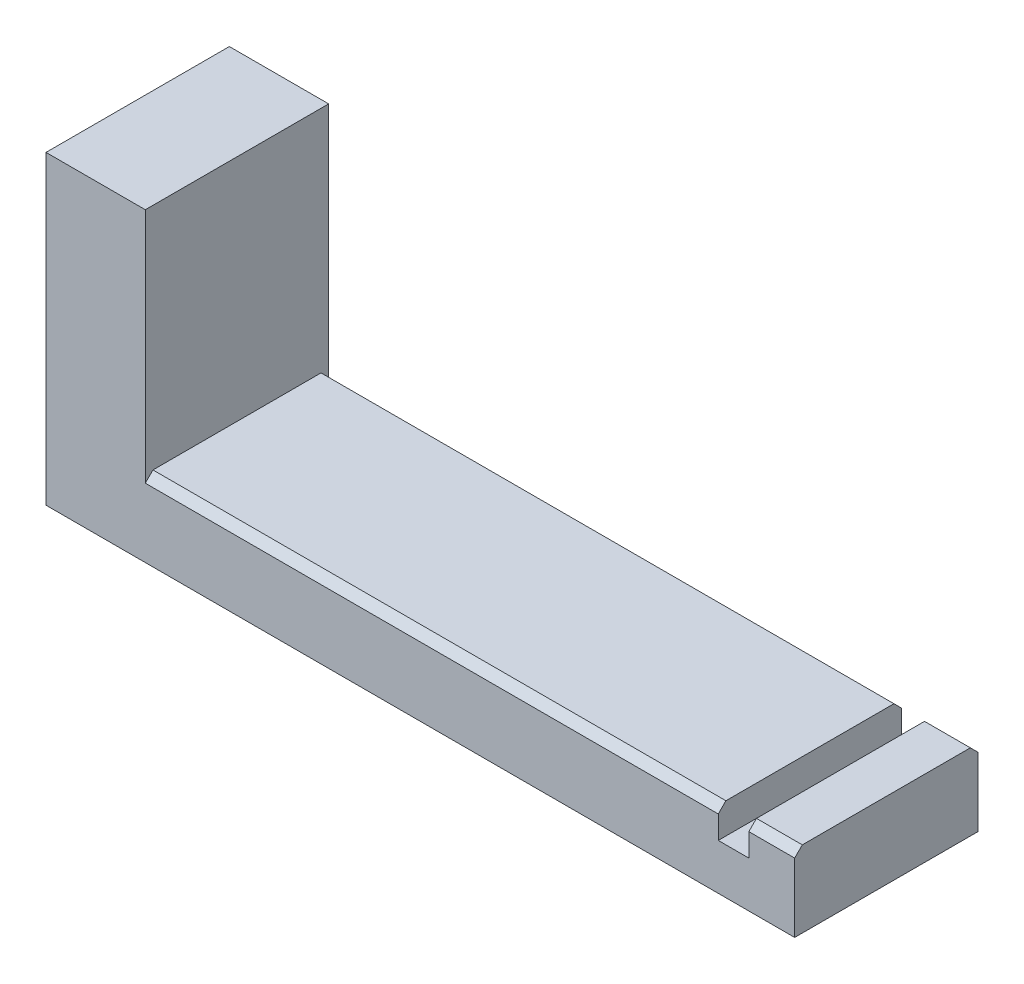
ISO-10303-21;
HEADER;
FILE_DESCRIPTION(('STEP AP214'),'2;1');
FILE_NAME('part.step','',(''),(''),'','','');
FILE_SCHEMA(('AUTOMOTIVE_DESIGN { 1 0 10303 214 1 1 1 1 }'));
ENDSEC;
DATA;
#1=APPLICATION_CONTEXT('core data for automotive mechanical design processes');
#2=APPLICATION_PROTOCOL_DEFINITION('international standard','automotive_design',2000,#1);
#3=PRODUCT_CONTEXT('',#1,'mechanical');
#4=PRODUCT('Part','Part','',(#3));
#5=PRODUCT_RELATED_PRODUCT_CATEGORY('part','',(#4));
#6=PRODUCT_DEFINITION_FORMATION('','',#4);
#7=PRODUCT_DEFINITION_CONTEXT('part definition',#1,'design');
#8=PRODUCT_DEFINITION('design','',#6,#7);
#9=PRODUCT_DEFINITION_SHAPE('','',#8);
#10=(LENGTH_UNIT() NAMED_UNIT(*) SI_UNIT(.MILLI.,.METRE.));
#11=(NAMED_UNIT(*) PLANE_ANGLE_UNIT() SI_UNIT($,.RADIAN.));
#12=(NAMED_UNIT(*) SI_UNIT($,.STERADIAN.) SOLID_ANGLE_UNIT());
#13=UNCERTAINTY_MEASURE_WITH_UNIT(LENGTH_MEASURE(1.E-05),#10,'distance_accuracy_value','');
#14=(GEOMETRIC_REPRESENTATION_CONTEXT(3) GLOBAL_UNCERTAINTY_ASSIGNED_CONTEXT((#13)) GLOBAL_UNIT_ASSIGNED_CONTEXT((#10,
#11,#12)) REPRESENTATION_CONTEXT('',''));
#15=CARTESIAN_POINT('',(0.,0.,0.));
#16=DIRECTION('',(0.,0.,1.));
#17=DIRECTION('',(1.,0.,0.));
#18=AXIS2_PLACEMENT_3D('',#15,#16,#17);
#19=CARTESIAN_POINT('',(98.,0.,12.));
#20=DIRECTION('',(0.,1.,0.));
#21=DIRECTION('',(-1.,0.,0.));
#22=AXIS2_PLACEMENT_3D('',#19,#20,#21);
#23=PLANE('',#22);
#24=DIRECTION('',(1.,0.,0.));
#25=VECTOR('',#24,1.);
#26=CARTESIAN_POINT('',(98.,0.,-12.));
#27=LINE('',#26,#25);
#28=CARTESIAN_POINT('',(0.,0.,-12.));
#29=VERTEX_POINT('',#28);
#30=CARTESIAN_POINT('',(98.,0.,-12.));
#31=VERTEX_POINT('',#30);
#32=EDGE_CURVE('E172',#29,#31,#27,.T.);
#33=ORIENTED_EDGE('',*,*,#32,.T.);
#34=DIRECTION('',(0.,0.,-1.));
#35=VECTOR('',#34,1.);
#36=CARTESIAN_POINT('',(98.,0.,12.));
#37=LINE('',#36,#35);
#38=CARTESIAN_POINT('',(98.,0.,12.));
#39=VERTEX_POINT('',#38);
#40=EDGE_CURVE('E151',#39,#31,#37,.T.);
#41=ORIENTED_EDGE('',*,*,#40,.F.);
#42=DIRECTION('',(1.,0.,0.));
#43=VECTOR('',#42,1.);
#44=CARTESIAN_POINT('',(98.,0.,12.));
#45=LINE('',#44,#43);
#46=CARTESIAN_POINT('',(0.,0.,12.));
#47=VERTEX_POINT('',#46);
#48=EDGE_CURVE('E160',#47,#39,#45,.T.);
#49=ORIENTED_EDGE('',*,*,#48,.F.);
#50=DIRECTION('',(0.,0.,-1.));
#51=VECTOR('',#50,1.);
#52=CARTESIAN_POINT('',(0.,0.,12.));
#53=LINE('',#52,#51);
#54=EDGE_CURVE('E243',#47,#29,#53,.T.);
#55=ORIENTED_EDGE('',*,*,#54,.T.);
#56=EDGE_LOOP('',(#33,#41,#49,#55));
#57=FACE_BOUND('',#56,.T.);
#58=ADVANCED_FACE('F43',(#57),#23,.F.);
#59=CARTESIAN_POINT('',(98.,10.,12.));
#60=DIRECTION('',(-1.,0.,0.));
#61=DIRECTION('',(0.,0.,1.));
#62=AXIS2_PLACEMENT_3D('',#59,#60,#61);
#63=PLANE('',#62);
#64=DIRECTION('',(0.,1.,0.));
#65=VECTOR('',#64,1.);
#66=CARTESIAN_POINT('',(98.,10.,-12.));
#67=LINE('',#66,#65);
#68=CARTESIAN_POINT('',(98.,9.,-12.));
#69=VERTEX_POINT('',#68);
#70=EDGE_CURVE('E280',#31,#69,#67,.T.);
#71=ORIENTED_EDGE('',*,*,#70,.T.);
#72=DIRECTION('',(0.,0.707106781186548,0.707106781186547));
#73=VECTOR('',#72,1.);
#74=CARTESIAN_POINT('',(98.,10.,-11.));
#75=LINE('',#74,#73);
#76=CARTESIAN_POINT('',(98.,10.,-11.));
#77=VERTEX_POINT('',#76);
#78=EDGE_CURVE('E194',#69,#77,#75,.T.);
#79=ORIENTED_EDGE('',*,*,#78,.T.);
#80=DIRECTION('',(0.,0.,-1.));
#81=VECTOR('',#80,1.);
#82=CARTESIAN_POINT('',(98.,10.,12.));
#83=LINE('',#82,#81);
#84=CARTESIAN_POINT('',(98.,10.,11.));
#85=VERTEX_POINT('',#84);
#86=EDGE_CURVE('E174',#85,#77,#83,.T.);
#87=ORIENTED_EDGE('',*,*,#86,.F.);
#88=DIRECTION('',(0.,0.707106781186548,-0.707106781186547));
#89=VECTOR('',#88,1.);
#90=CARTESIAN_POINT('',(98.,9.,12.));
#91=LINE('',#90,#89);
#92=CARTESIAN_POINT('',(98.,8.99999999999999,12.));
#93=VERTEX_POINT('',#92);
#94=EDGE_CURVE('E155',#85,#93,#91,.F.);
#95=ORIENTED_EDGE('',*,*,#94,.T.);
#96=DIRECTION('',(0.,1.,0.));
#97=VECTOR('',#96,1.);
#98=CARTESIAN_POINT('',(98.,10.,12.));
#99=LINE('',#98,#97);
#100=EDGE_CURVE('E146',#39,#93,#99,.T.);
#101=ORIENTED_EDGE('',*,*,#100,.F.);
#102=ORIENTED_EDGE('',*,*,#40,.T.);
#103=EDGE_LOOP('',(#71,#79,#87,#95,#101,#102));
#104=FACE_BOUND('',#103,.T.);
#105=ADVANCED_FACE('F149',(#104),#63,.F.);
#106=CARTESIAN_POINT('',(92.,10.,12.));
#107=DIRECTION('',(0.,-1.,0.));
#108=DIRECTION('',(1.,0.,0.));
#109=AXIS2_PLACEMENT_3D('',#106,#107,#108);
#110=PLANE('',#109);
#111=ORIENTED_EDGE('',*,*,#86,.T.);
#112=DIRECTION('',(-1.,0.,0.));
#113=VECTOR('',#112,1.);
#114=CARTESIAN_POINT('',(92.,10.,-11.));
#115=LINE('',#114,#113);
#116=CARTESIAN_POINT('',(92.,10.,-11.));
#117=VERTEX_POINT('',#116);
#118=EDGE_CURVE('E176',#77,#117,#115,.T.);
#119=ORIENTED_EDGE('',*,*,#118,.T.);
#120=DIRECTION('',(0.,0.,-1.));
#121=VECTOR('',#120,1.);
#122=CARTESIAN_POINT('',(92.,10.,12.));
#123=LINE('',#122,#121);
#124=CARTESIAN_POINT('',(92.,10.,11.));
#125=VERTEX_POINT('',#124);
#126=EDGE_CURVE('E179',#125,#117,#123,.T.);
#127=ORIENTED_EDGE('',*,*,#126,.F.);
#128=DIRECTION('',(1.,0.,0.));
#129=VECTOR('',#128,1.);
#130=CARTESIAN_POINT('',(92.,10.,11.));
#131=LINE('',#130,#129);
#132=EDGE_CURVE('E173',#125,#85,#131,.T.);
#133=ORIENTED_EDGE('',*,*,#132,.T.);
#134=EDGE_LOOP('',(#111,#119,#127,#133));
#135=FACE_BOUND('',#134,.T.);
#136=ADVANCED_FACE('F263',(#135),#110,.F.);
#137=CARTESIAN_POINT('',(92.,6.,12.));
#138=DIRECTION('',(1.,0.,0.));
#139=DIRECTION('',(0.,0.,-1.));
#140=AXIS2_PLACEMENT_3D('',#137,#138,#139);
#141=PLANE('',#140);
#142=ORIENTED_EDGE('',*,*,#126,.T.);
#143=DIRECTION('',(0.,-0.707106781186548,-0.707106781186547));
#144=VECTOR('',#143,1.);
#145=CARTESIAN_POINT('',(92.,10.,-11.));
#146=LINE('',#145,#144);
#147=CARTESIAN_POINT('',(92.,9.,-12.));
#148=VERTEX_POINT('',#147);
#149=EDGE_CURVE('E187',#117,#148,#146,.T.);
#150=ORIENTED_EDGE('',*,*,#149,.T.);
#151=DIRECTION('',(0.,-1.,0.));
#152=VECTOR('',#151,1.);
#153=CARTESIAN_POINT('',(92.,6.,-12.));
#154=LINE('',#153,#152);
#155=CARTESIAN_POINT('',(92.,6.,-12.));
#156=VERTEX_POINT('',#155);
#157=EDGE_CURVE('E237',#148,#156,#154,.T.);
#158=ORIENTED_EDGE('',*,*,#157,.T.);
#159=DIRECTION('',(0.,0.,-1.));
#160=VECTOR('',#159,1.);
#161=CARTESIAN_POINT('',(92.,6.,12.));
#162=LINE('',#161,#160);
#163=CARTESIAN_POINT('',(92.,6.,12.));
#164=VERTEX_POINT('',#163);
#165=EDGE_CURVE('E254',#164,#156,#162,.T.);
#166=ORIENTED_EDGE('',*,*,#165,.F.);
#167=DIRECTION('',(0.,-1.,0.));
#168=VECTOR('',#167,1.);
#169=CARTESIAN_POINT('',(92.,6.,12.));
#170=LINE('',#169,#168);
#171=CARTESIAN_POINT('',(92.,8.99999999999999,12.));
#172=VERTEX_POINT('',#171);
#173=EDGE_CURVE('E159',#172,#164,#170,.T.);
#174=ORIENTED_EDGE('',*,*,#173,.F.);
#175=DIRECTION('',(0.,-0.707106781186548,0.707106781186547));
#176=VECTOR('',#175,1.);
#177=CARTESIAN_POINT('',(92.,9.,12.));
#178=LINE('',#177,#176);
#179=EDGE_CURVE('E185',#172,#125,#178,.F.);
#180=ORIENTED_EDGE('',*,*,#179,.T.);
#181=EDGE_LOOP('',(#142,#150,#158,#166,#174,#180));
#182=FACE_BOUND('',#181,.T.);
#183=ADVANCED_FACE('F259',(#182),#141,.F.);
#184=CARTESIAN_POINT('',(88.,6.,12.));
#185=DIRECTION('',(0.,-1.,0.));
#186=DIRECTION('',(0.,0.,-1.));
#187=AXIS2_PLACEMENT_3D('',#184,#185,#186);
#188=PLANE('',#187);
#189=DIRECTION('',(-1.,0.,0.));
#190=VECTOR('',#189,1.);
#191=CARTESIAN_POINT('',(88.,6.,-12.));
#192=LINE('',#191,#190);
#193=CARTESIAN_POINT('',(88.,6.,-12.));
#194=VERTEX_POINT('',#193);
#195=EDGE_CURVE('E233',#156,#194,#192,.T.);
#196=ORIENTED_EDGE('',*,*,#195,.T.);
#197=DIRECTION('',(0.,0.,-1.));
#198=VECTOR('',#197,1.);
#199=CARTESIAN_POINT('',(88.,6.,12.));
#200=LINE('',#199,#198);
#201=CARTESIAN_POINT('',(88.,6.,12.));
#202=VERTEX_POINT('',#201);
#203=EDGE_CURVE('E232',#202,#194,#200,.T.);
#204=ORIENTED_EDGE('',*,*,#203,.F.);
#205=DIRECTION('',(-1.,0.,0.));
#206=VECTOR('',#205,1.);
#207=CARTESIAN_POINT('',(88.,6.,12.));
#208=LINE('',#207,#206);
#209=EDGE_CURVE('E269',#164,#202,#208,.T.);
#210=ORIENTED_EDGE('',*,*,#209,.F.);
#211=ORIENTED_EDGE('',*,*,#165,.T.);
#212=EDGE_LOOP('',(#196,#204,#210,#211));
#213=FACE_BOUND('',#212,.T.);
#214=ADVANCED_FACE('F283',(#213),#188,.F.);
#215=CARTESIAN_POINT('',(88.,10.,12.));
#216=DIRECTION('',(-1.,0.,0.));
#217=DIRECTION('',(0.,0.,1.));
#218=AXIS2_PLACEMENT_3D('',#215,#216,#217);
#219=PLANE('',#218);
#220=DIRECTION('',(0.,1.,0.));
#221=VECTOR('',#220,1.);
#222=CARTESIAN_POINT('',(88.,10.,-12.));
#223=LINE('',#222,#221);
#224=CARTESIAN_POINT('',(88.,9.,-12.));
#225=VERTEX_POINT('',#224);
#226=EDGE_CURVE('E226',#194,#225,#223,.T.);
#227=ORIENTED_EDGE('',*,*,#226,.T.);
#228=DIRECTION('',(0.,0.707106781186548,0.707106781186548));
#229=VECTOR('',#228,1.);
#230=CARTESIAN_POINT('',(88.,10.,-11.));
#231=LINE('',#230,#229);
#232=CARTESIAN_POINT('',(88.,10.,-11.));
#233=VERTEX_POINT('',#232);
#234=EDGE_CURVE('E202',#225,#233,#231,.T.);
#235=ORIENTED_EDGE('',*,*,#234,.T.);
#236=DIRECTION('',(0.,0.,-1.));
#237=VECTOR('',#236,1.);
#238=CARTESIAN_POINT('',(88.,10.,12.));
#239=LINE('',#238,#237);
#240=CARTESIAN_POINT('',(88.,10.,11.));
#241=VERTEX_POINT('',#240);
#242=EDGE_CURVE('E251',#241,#233,#239,.T.);
#243=ORIENTED_EDGE('',*,*,#242,.F.);
#244=DIRECTION('',(0.,0.707106781186548,-0.707106781186548));
#245=VECTOR('',#244,1.);
#246=CARTESIAN_POINT('',(88.,8.99999999999999,12.));
#247=LINE('',#246,#245);
#248=CARTESIAN_POINT('',(88.,8.99999999999999,12.));
#249=VERTEX_POINT('',#248);
#250=EDGE_CURVE('E66',#241,#249,#247,.F.);
#251=ORIENTED_EDGE('',*,*,#250,.T.);
#252=DIRECTION('',(0.,1.,0.));
#253=VECTOR('',#252,1.);
#254=CARTESIAN_POINT('',(88.,10.,12.));
#255=LINE('',#254,#253);
#256=EDGE_CURVE('E271',#202,#249,#255,.T.);
#257=ORIENTED_EDGE('',*,*,#256,.F.);
#258=ORIENTED_EDGE('',*,*,#203,.T.);
#259=EDGE_LOOP('',(#227,#235,#243,#251,#257,#258));
#260=FACE_BOUND('',#259,.T.);
#261=ADVANCED_FACE('F229',(#260),#219,.F.);
#262=CARTESIAN_POINT('',(13.,10.,12.));
#263=DIRECTION('',(0.,-1.,0.));
#264=DIRECTION('',(0.,0.,-1.));
#265=AXIS2_PLACEMENT_3D('',#262,#263,#264);
#266=PLANE('',#265);
#267=ORIENTED_EDGE('',*,*,#242,.T.);
#268=DIRECTION('',(-1.,0.,0.));
#269=VECTOR('',#268,1.);
#270=CARTESIAN_POINT('',(13.,10.,-11.));
#271=LINE('',#270,#269);
#272=CARTESIAN_POINT('',(13.,10.,-11.));
#273=VERTEX_POINT('',#272);
#274=EDGE_CURVE('E198',#233,#273,#271,.T.);
#275=ORIENTED_EDGE('',*,*,#274,.T.);
#276=DIRECTION('',(0.,0.,-1.));
#277=VECTOR('',#276,1.);
#278=CARTESIAN_POINT('',(13.,10.,12.));
#279=LINE('',#278,#277);
#280=CARTESIAN_POINT('',(13.,10.,11.));
#281=VERTEX_POINT('',#280);
#282=EDGE_CURVE('E215',#281,#273,#279,.T.);
#283=ORIENTED_EDGE('',*,*,#282,.F.);
#284=DIRECTION('',(1.,0.,0.));
#285=VECTOR('',#284,1.);
#286=CARTESIAN_POINT('',(13.,10.,11.));
#287=LINE('',#286,#285);
#288=EDGE_CURVE('E196',#281,#241,#287,.T.);
#289=ORIENTED_EDGE('',*,*,#288,.T.);
#290=EDGE_LOOP('',(#267,#275,#283,#289));
#291=FACE_BOUND('',#290,.T.);
#292=ADVANCED_FACE('F288',(#291),#266,.F.);
#293=CARTESIAN_POINT('',(13.,40.,12.));
#294=DIRECTION('',(-1.,0.,0.));
#295=DIRECTION('',(0.,-1.,0.));
#296=AXIS2_PLACEMENT_3D('',#293,#294,#295);
#297=PLANE('',#296);
#298=DIRECTION('',(0.,1.,0.));
#299=VECTOR('',#298,1.);
#300=CARTESIAN_POINT('',(13.,40.,-12.));
#301=LINE('',#300,#299);
#302=CARTESIAN_POINT('',(13.,9.,-12.));
#303=VERTEX_POINT('',#302);
#304=CARTESIAN_POINT('',(13.,40.,-12.));
#305=VERTEX_POINT('',#304);
#306=EDGE_CURVE('E212',#303,#305,#301,.T.);
#307=ORIENTED_EDGE('',*,*,#306,.T.);
#308=DIRECTION('',(0.,0.,-1.));
#309=VECTOR('',#308,1.);
#310=CARTESIAN_POINT('',(13.,40.,12.));
#311=LINE('',#310,#309);
#312=CARTESIAN_POINT('',(13.,40.,12.));
#313=VERTEX_POINT('',#312);
#314=EDGE_CURVE('E248',#313,#305,#311,.T.);
#315=ORIENTED_EDGE('',*,*,#314,.F.);
#316=DIRECTION('',(0.,1.,0.));
#317=VECTOR('',#316,1.);
#318=CARTESIAN_POINT('',(13.,40.,12.));
#319=LINE('',#318,#317);
#320=CARTESIAN_POINT('',(13.,8.99999999999999,12.));
#321=VERTEX_POINT('',#320);
#322=EDGE_CURVE('E58',#321,#313,#319,.T.);
#323=ORIENTED_EDGE('',*,*,#322,.F.);
#324=DIRECTION('',(0.,-0.707106781186548,0.707106781186548));
#325=VECTOR('',#324,1.);
#326=CARTESIAN_POINT('',(13.,24.5,-3.50000000000001));
#327=LINE('',#326,#325);
#328=EDGE_CURVE('E11',#321,#281,#327,.F.);
#329=ORIENTED_EDGE('',*,*,#328,.T.);
#330=ORIENTED_EDGE('',*,*,#282,.T.);
#331=DIRECTION('',(0.,-0.707106781186548,-0.707106781186548));
#332=VECTOR('',#331,1.);
#333=CARTESIAN_POINT('',(13.,36.5,15.5));
#334=LINE('',#333,#332);
#335=EDGE_CURVE('E52',#273,#303,#334,.T.);
#336=ORIENTED_EDGE('',*,*,#335,.T.);
#337=EDGE_LOOP('',(#307,#315,#323,#329,#330,#336));
#338=FACE_BOUND('',#337,.T.);
#339=ADVANCED_FACE('F211',(#338),#297,.F.);
#340=CARTESIAN_POINT('',(0.,40.,12.));
#341=DIRECTION('',(0.,-1.,0.));
#342=DIRECTION('',(0.,0.,-1.));
#343=AXIS2_PLACEMENT_3D('',#340,#341,#342);
#344=PLANE('',#343);
#345=DIRECTION('',(-1.,0.,0.));
#346=VECTOR('',#345,1.);
#347=CARTESIAN_POINT('',(0.,40.,-12.));
#348=LINE('',#347,#346);
#349=CARTESIAN_POINT('',(0.,40.,-12.));
#350=VERTEX_POINT('',#349);
#351=EDGE_CURVE('E235',#305,#350,#348,.T.);
#352=ORIENTED_EDGE('',*,*,#351,.T.);
#353=DIRECTION('',(0.,0.,-1.));
#354=VECTOR('',#353,1.);
#355=CARTESIAN_POINT('',(0.,40.,12.));
#356=LINE('',#355,#354);
#357=CARTESIAN_POINT('',(0.,40.,12.));
#358=VERTEX_POINT('',#357);
#359=EDGE_CURVE('E245',#358,#350,#356,.T.);
#360=ORIENTED_EDGE('',*,*,#359,.F.);
#361=DIRECTION('',(-1.,0.,0.));
#362=VECTOR('',#361,1.);
#363=CARTESIAN_POINT('',(0.,40.,12.));
#364=LINE('',#363,#362);
#365=EDGE_CURVE('E276',#313,#358,#364,.T.);
#366=ORIENTED_EDGE('',*,*,#365,.F.);
#367=ORIENTED_EDGE('',*,*,#314,.T.);
#368=EDGE_LOOP('',(#352,#360,#366,#367));
#369=FACE_BOUND('',#368,.T.);
#370=ADVANCED_FACE('F295',(#369),#344,.F.);
#371=CARTESIAN_POINT('',(0.,0.,12.));
#372=DIRECTION('',(1.,0.,0.));
#373=DIRECTION('',(0.,0.,-1.));
#374=AXIS2_PLACEMENT_3D('',#371,#372,#373);
#375=PLANE('',#374);
#376=DIRECTION('',(0.,-1.,0.));
#377=VECTOR('',#376,1.);
#378=CARTESIAN_POINT('',(0.,0.,-12.));
#379=LINE('',#378,#377);
#380=EDGE_CURVE('E169',#350,#29,#379,.T.);
#381=ORIENTED_EDGE('',*,*,#380,.T.);
#382=ORIENTED_EDGE('',*,*,#54,.F.);
#383=DIRECTION('',(0.,-1.,0.));
#384=VECTOR('',#383,1.);
#385=CARTESIAN_POINT('',(0.,0.,12.));
#386=LINE('',#385,#384);
#387=EDGE_CURVE('E165',#358,#47,#386,.T.);
#388=ORIENTED_EDGE('',*,*,#387,.F.);
#389=ORIENTED_EDGE('',*,*,#359,.T.);
#390=EDGE_LOOP('',(#381,#382,#388,#389));
#391=FACE_BOUND('',#390,.T.);
#392=ADVANCED_FACE('F350',(#391),#375,.F.);
#393=CARTESIAN_POINT('',(0.,0.,12.));
#394=DIRECTION('',(0.,0.,-1.));
#395=DIRECTION('',(-1.,0.,0.));
#396=AXIS2_PLACEMENT_3D('',#393,#394,#395);
#397=PLANE('',#396);
#398=ORIENTED_EDGE('',*,*,#100,.T.);
#399=DIRECTION('',(-1.,0.,0.));
#400=VECTOR('',#399,1.);
#401=CARTESIAN_POINT('',(0.,9.00000000000001,12.));
#402=LINE('',#401,#400);
#403=EDGE_CURVE('E207',#93,#172,#402,.T.);
#404=ORIENTED_EDGE('',*,*,#403,.T.);
#405=ORIENTED_EDGE('',*,*,#173,.T.);
#406=ORIENTED_EDGE('',*,*,#209,.T.);
#407=ORIENTED_EDGE('',*,*,#256,.T.);
#408=DIRECTION('',(-1.,0.,0.));
#409=VECTOR('',#408,1.);
#410=CARTESIAN_POINT('',(0.,8.99999999999999,12.));
#411=LINE('',#410,#409);
#412=EDGE_CURVE('E204',#249,#321,#411,.T.);
#413=ORIENTED_EDGE('',*,*,#412,.T.);
#414=ORIENTED_EDGE('',*,*,#322,.T.);
#415=ORIENTED_EDGE('',*,*,#365,.T.);
#416=ORIENTED_EDGE('',*,*,#387,.T.);
#417=ORIENTED_EDGE('',*,*,#48,.T.);
#418=EDGE_LOOP('',(#398,#404,#405,#406,#407,#413,#414,#415,#416,#417));
#419=FACE_BOUND('',#418,.T.);
#420=ADVANCED_FACE('F163',(#419),#397,.F.);
#421=CARTESIAN_POINT('',(0.,0.,-12.));
#422=DIRECTION('',(0.,0.,-1.));
#423=DIRECTION('',(-1.,0.,0.));
#424=AXIS2_PLACEMENT_3D('',#421,#422,#423);
#425=PLANE('',#424);
#426=ORIENTED_EDGE('',*,*,#157,.F.);
#427=DIRECTION('',(1.,0.,0.));
#428=VECTOR('',#427,1.);
#429=CARTESIAN_POINT('',(98.,9.,-12.));
#430=LINE('',#429,#428);
#431=EDGE_CURVE('E191',#148,#69,#430,.T.);
#432=ORIENTED_EDGE('',*,*,#431,.T.);
#433=ORIENTED_EDGE('',*,*,#70,.F.);
#434=ORIENTED_EDGE('',*,*,#32,.F.);
#435=ORIENTED_EDGE('',*,*,#380,.F.);
#436=ORIENTED_EDGE('',*,*,#351,.F.);
#437=ORIENTED_EDGE('',*,*,#306,.F.);
#438=DIRECTION('',(1.,0.,0.));
#439=VECTOR('',#438,1.);
#440=CARTESIAN_POINT('',(88.,9.,-12.));
#441=LINE('',#440,#439);
#442=EDGE_CURVE('E189',#303,#225,#441,.T.);
#443=ORIENTED_EDGE('',*,*,#442,.T.);
#444=ORIENTED_EDGE('',*,*,#226,.F.);
#445=ORIENTED_EDGE('',*,*,#195,.F.);
#446=EDGE_LOOP('',(#426,#432,#433,#434,#435,#436,#437,#443,#444,#445));
#447=FACE_BOUND('',#446,.T.);
#448=ADVANCED_FACE('F224',(#447),#425,.T.);
#449=CARTESIAN_POINT('',(92.,10.,-11.));
#450=DIRECTION('',(0.,0.707106781186547,-0.707106781186548));
#451=DIRECTION('',(1.,0.,0.));
#452=AXIS2_PLACEMENT_3D('',#449,#450,#451);
#453=PLANE('',#452);
#454=ORIENTED_EDGE('',*,*,#78,.F.);
#455=ORIENTED_EDGE('',*,*,#431,.F.);
#456=ORIENTED_EDGE('',*,*,#149,.F.);
#457=ORIENTED_EDGE('',*,*,#118,.F.);
#458=EDGE_LOOP('',(#454,#455,#456,#457));
#459=FACE_BOUND('',#458,.T.);
#460=ADVANCED_FACE('F308',(#459),#453,.T.);
#461=CARTESIAN_POINT('',(13.,10.,-11.));
#462=DIRECTION('',(0.,0.707106781186547,-0.707106781186547));
#463=DIRECTION('',(1.,0.,0.));
#464=AXIS2_PLACEMENT_3D('',#461,#462,#463);
#465=PLANE('',#464);
#466=ORIENTED_EDGE('',*,*,#234,.F.);
#467=ORIENTED_EDGE('',*,*,#442,.F.);
#468=ORIENTED_EDGE('',*,*,#335,.F.);
#469=ORIENTED_EDGE('',*,*,#274,.F.);
#470=EDGE_LOOP('',(#466,#467,#468,#469));
#471=FACE_BOUND('',#470,.T.);
#472=ADVANCED_FACE('F219',(#471),#465,.T.);
#473=CARTESIAN_POINT('',(0.,9.00000000000001,12.));
#474=DIRECTION('',(0.,-0.707106781186547,-0.707106781186548));
#475=DIRECTION('',(-1.,0.,0.));
#476=AXIS2_PLACEMENT_3D('',#473,#474,#475);
#477=PLANE('',#476);
#478=ORIENTED_EDGE('',*,*,#94,.F.);
#479=ORIENTED_EDGE('',*,*,#132,.F.);
#480=ORIENTED_EDGE('',*,*,#179,.F.);
#481=ORIENTED_EDGE('',*,*,#403,.F.);
#482=EDGE_LOOP('',(#478,#479,#480,#481));
#483=FACE_BOUND('',#482,.T.);
#484=ADVANCED_FACE('F266',(#483),#477,.F.);
#485=CARTESIAN_POINT('',(0.,8.99999999999999,12.));
#486=DIRECTION('',(0.,-0.707106781186547,-0.707106781186547));
#487=DIRECTION('',(-1.,0.,0.));
#488=AXIS2_PLACEMENT_3D('',#485,#486,#487);
#489=PLANE('',#488);
#490=ORIENTED_EDGE('',*,*,#250,.F.);
#491=ORIENTED_EDGE('',*,*,#288,.F.);
#492=ORIENTED_EDGE('',*,*,#328,.F.);
#493=ORIENTED_EDGE('',*,*,#412,.F.);
#494=EDGE_LOOP('',(#490,#491,#492,#493));
#495=FACE_BOUND('',#494,.T.);
#496=ADVANCED_FACE('F46',(#495),#489,.F.);
#497=CLOSED_SHELL('',(#58,#105,#136,#183,#214,#261,#292,#339,#370,#392,#420,#448,#460,#472,#484,#496));
#498=MANIFOLD_SOLID_BREP('B2',#497);
#499=ADVANCED_BREP_SHAPE_REPRESENTATION('',(#18,#498),#14);
#500=SHAPE_DEFINITION_REPRESENTATION(#9,#499);
ENDSEC;
END-ISO-10303-21;
